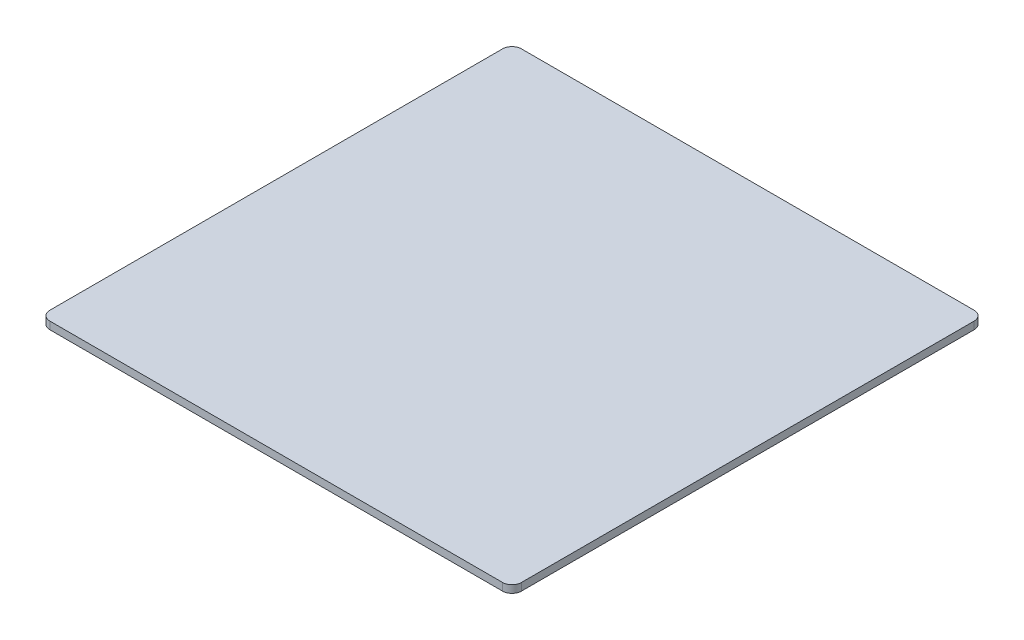
ISO-10303-21;
HEADER;
FILE_DESCRIPTION(('STEP AP214'),'2;1');
FILE_NAME('part.step','',(''),(''),'','','');
FILE_SCHEMA(('AUTOMOTIVE_DESIGN { 1 0 10303 214 1 1 1 1 }'));
ENDSEC;
DATA;
#1=APPLICATION_CONTEXT('core data for automotive mechanical design processes');
#2=APPLICATION_PROTOCOL_DEFINITION('international standard','automotive_design',2000,#1);
#3=PRODUCT_CONTEXT('',#1,'mechanical');
#4=PRODUCT('Part','Part','',(#3));
#5=PRODUCT_RELATED_PRODUCT_CATEGORY('part','',(#4));
#6=PRODUCT_DEFINITION_FORMATION('','',#4);
#7=PRODUCT_DEFINITION_CONTEXT('part definition',#1,'design');
#8=PRODUCT_DEFINITION('design','',#6,#7);
#9=PRODUCT_DEFINITION_SHAPE('','',#8);
#10=(LENGTH_UNIT() NAMED_UNIT(*) SI_UNIT(.MILLI.,.METRE.));
#11=(NAMED_UNIT(*) PLANE_ANGLE_UNIT() SI_UNIT($,.RADIAN.));
#12=(NAMED_UNIT(*) SI_UNIT($,.STERADIAN.) SOLID_ANGLE_UNIT());
#13=UNCERTAINTY_MEASURE_WITH_UNIT(LENGTH_MEASURE(1.E-05),#10,'distance_accuracy_value','');
#14=(GEOMETRIC_REPRESENTATION_CONTEXT(3) GLOBAL_UNCERTAINTY_ASSIGNED_CONTEXT((#13)) GLOBAL_UNIT_ASSIGNED_CONTEXT((#10,
#11,#12)) REPRESENTATION_CONTEXT('',''));
#15=CARTESIAN_POINT('',(0.,0.,0.));
#16=DIRECTION('',(0.,0.,1.));
#17=DIRECTION('',(1.,0.,0.));
#18=AXIS2_PLACEMENT_3D('',#15,#16,#17);
#19=CARTESIAN_POINT('',(50.,1.6,50.));
#20=DIRECTION('',(-1.,0.,0.));
#21=DIRECTION('',(0.,0.,1.));
#22=AXIS2_PLACEMENT_3D('',#19,#20,#21);
#23=PLANE('',#22);
#24=DIRECTION('',(0.,0.,-1.));
#25=VECTOR('',#24,1.);
#26=CARTESIAN_POINT('',(50.,0.,50.));
#27=LINE('',#26,#25);
#28=CARTESIAN_POINT('',(50.,0.,48.));
#29=VERTEX_POINT('',#28);
#30=CARTESIAN_POINT('',(50.,0.,-48.));
#31=VERTEX_POINT('',#30);
#32=EDGE_CURVE('E138',#29,#31,#27,.T.);
#33=ORIENTED_EDGE('',*,*,#32,.T.);
#34=DIRECTION('',(0.,-1.,0.));
#35=VECTOR('',#34,1.);
#36=CARTESIAN_POINT('',(50.,1.6,-48.));
#37=LINE('',#36,#35);
#38=CARTESIAN_POINT('',(50.,1.6,-48.));
#39=VERTEX_POINT('',#38);
#40=EDGE_CURVE('E113',#31,#39,#37,.F.);
#41=ORIENTED_EDGE('',*,*,#40,.T.);
#42=DIRECTION('',(0.,0.,-1.));
#43=VECTOR('',#42,1.);
#44=CARTESIAN_POINT('',(50.,1.6,50.));
#45=LINE('',#44,#43);
#46=CARTESIAN_POINT('',(50.,1.6,48.));
#47=VERTEX_POINT('',#46);
#48=EDGE_CURVE('E150',#47,#39,#45,.T.);
#49=ORIENTED_EDGE('',*,*,#48,.F.);
#50=DIRECTION('',(0.,-1.,0.));
#51=VECTOR('',#50,1.);
#52=CARTESIAN_POINT('',(50.,1.6,48.));
#53=LINE('',#52,#51);
#54=EDGE_CURVE('E119',#47,#29,#53,.T.);
#55=ORIENTED_EDGE('',*,*,#54,.T.);
#56=EDGE_LOOP('',(#33,#41,#49,#55));
#57=FACE_BOUND('',#56,.T.);
#58=ADVANCED_FACE('F41',(#57),#23,.F.);
#59=CARTESIAN_POINT('',(-50.,1.6,-50.));
#60=DIRECTION('',(0.,0.,1.));
#61=DIRECTION('',(1.,0.,0.));
#62=AXIS2_PLACEMENT_3D('',#59,#60,#61);
#63=PLANE('',#62);
#64=DIRECTION('',(-1.,0.,0.));
#65=VECTOR('',#64,1.);
#66=CARTESIAN_POINT('',(-50.,1.6,-50.));
#67=LINE('',#66,#65);
#68=CARTESIAN_POINT('',(48.,1.6,-50.));
#69=VERTEX_POINT('',#68);
#70=CARTESIAN_POINT('',(-48.,1.6,-50.));
#71=VERTEX_POINT('',#70);
#72=EDGE_CURVE('E129',#69,#71,#67,.T.);
#73=ORIENTED_EDGE('',*,*,#72,.F.);
#74=DIRECTION('',(0.,-1.,0.));
#75=VECTOR('',#74,1.);
#76=CARTESIAN_POINT('',(48.,1.6,-50.));
#77=LINE('',#76,#75);
#78=CARTESIAN_POINT('',(48.,0.,-50.));
#79=VERTEX_POINT('',#78);
#80=EDGE_CURVE('E112',#69,#79,#77,.T.);
#81=ORIENTED_EDGE('',*,*,#80,.T.);
#82=DIRECTION('',(-1.,0.,0.));
#83=VECTOR('',#82,1.);
#84=CARTESIAN_POINT('',(-50.,0.,-50.));
#85=LINE('',#84,#83);
#86=CARTESIAN_POINT('',(-48.,0.,-50.));
#87=VERTEX_POINT('',#86);
#88=EDGE_CURVE('E126',#79,#87,#85,.T.);
#89=ORIENTED_EDGE('',*,*,#88,.T.);
#90=DIRECTION('',(0.,-1.,0.));
#91=VECTOR('',#90,1.);
#92=CARTESIAN_POINT('',(-48.,1.6,-50.));
#93=LINE('',#92,#91);
#94=EDGE_CURVE('E132',#87,#71,#93,.F.);
#95=ORIENTED_EDGE('',*,*,#94,.T.);
#96=EDGE_LOOP('',(#73,#81,#89,#95));
#97=FACE_BOUND('',#96,.T.);
#98=ADVANCED_FACE('F125',(#97),#63,.F.);
#99=CARTESIAN_POINT('',(-50.,1.6,50.));
#100=DIRECTION('',(1.,0.,0.));
#101=DIRECTION('',(0.,0.,-1.));
#102=AXIS2_PLACEMENT_3D('',#99,#100,#101);
#103=PLANE('',#102);
#104=DIRECTION('',(0.,0.,1.));
#105=VECTOR('',#104,1.);
#106=CARTESIAN_POINT('',(-50.,1.6,50.));
#107=LINE('',#106,#105);
#108=CARTESIAN_POINT('',(-50.,1.6,-48.));
#109=VERTEX_POINT('',#108);
#110=CARTESIAN_POINT('',(-50.,1.6,48.));
#111=VERTEX_POINT('',#110);
#112=EDGE_CURVE('E186',#109,#111,#107,.T.);
#113=ORIENTED_EDGE('',*,*,#112,.F.);
#114=DIRECTION('',(0.,-1.,0.));
#115=VECTOR('',#114,1.);
#116=CARTESIAN_POINT('',(-50.,1.6,-48.));
#117=LINE('',#116,#115);
#118=CARTESIAN_POINT('',(-50.,0.,-48.));
#119=VERTEX_POINT('',#118);
#120=EDGE_CURVE('E180',#109,#119,#117,.T.);
#121=ORIENTED_EDGE('',*,*,#120,.T.);
#122=DIRECTION('',(0.,0.,1.));
#123=VECTOR('',#122,1.);
#124=CARTESIAN_POINT('',(-50.,0.,50.));
#125=LINE('',#124,#123);
#126=CARTESIAN_POINT('',(-50.,0.,48.));
#127=VERTEX_POINT('',#126);
#128=EDGE_CURVE('E137',#119,#127,#125,.T.);
#129=ORIENTED_EDGE('',*,*,#128,.T.);
#130=DIRECTION('',(0.,-1.,0.));
#131=VECTOR('',#130,1.);
#132=CARTESIAN_POINT('',(-50.,1.6,48.));
#133=LINE('',#132,#131);
#134=EDGE_CURVE('E177',#127,#111,#133,.F.);
#135=ORIENTED_EDGE('',*,*,#134,.T.);
#136=EDGE_LOOP('',(#113,#121,#129,#135));
#137=FACE_BOUND('',#136,.T.);
#138=ADVANCED_FACE('F207',(#137),#103,.F.);
#139=CARTESIAN_POINT('',(-50.,1.6,50.));
#140=DIRECTION('',(0.,0.,-1.));
#141=DIRECTION('',(-1.,0.,0.));
#142=AXIS2_PLACEMENT_3D('',#139,#140,#141);
#143=PLANE('',#142);
#144=DIRECTION('',(1.,0.,0.));
#145=VECTOR('',#144,1.);
#146=CARTESIAN_POINT('',(-50.,1.6,50.));
#147=LINE('',#146,#145);
#148=CARTESIAN_POINT('',(-48.,1.6,50.));
#149=VERTEX_POINT('',#148);
#150=CARTESIAN_POINT('',(48.,1.6,50.));
#151=VERTEX_POINT('',#150);
#152=EDGE_CURVE('E152',#149,#151,#147,.T.);
#153=ORIENTED_EDGE('',*,*,#152,.F.);
#154=DIRECTION('',(0.,-1.,0.));
#155=VECTOR('',#154,1.);
#156=CARTESIAN_POINT('',(-48.,1.6,50.));
#157=LINE('',#156,#155);
#158=CARTESIAN_POINT('',(-48.,0.,50.));
#159=VERTEX_POINT('',#158);
#160=EDGE_CURVE('E11',#149,#159,#157,.T.);
#161=ORIENTED_EDGE('',*,*,#160,.T.);
#162=DIRECTION('',(1.,0.,0.));
#163=VECTOR('',#162,1.);
#164=CARTESIAN_POINT('',(-50.,0.,50.));
#165=LINE('',#164,#163);
#166=CARTESIAN_POINT('',(48.,0.,50.));
#167=VERTEX_POINT('',#166);
#168=EDGE_CURVE('E143',#159,#167,#165,.T.);
#169=ORIENTED_EDGE('',*,*,#168,.T.);
#170=DIRECTION('',(0.,-1.,0.));
#171=VECTOR('',#170,1.);
#172=CARTESIAN_POINT('',(48.,1.6,50.));
#173=LINE('',#172,#171);
#174=EDGE_CURVE('E50',#167,#151,#173,.F.);
#175=ORIENTED_EDGE('',*,*,#174,.T.);
#176=EDGE_LOOP('',(#153,#161,#169,#175));
#177=FACE_BOUND('',#176,.T.);
#178=ADVANCED_FACE('F200',(#177),#143,.F.);
#179=CARTESIAN_POINT('',(0.,1.6,0.));
#180=DIRECTION('',(0.,-1.,0.));
#181=DIRECTION('',(0.,0.,-1.));
#182=AXIS2_PLACEMENT_3D('',#179,#180,#181);
#183=PLANE('',#182);
#184=ORIENTED_EDGE('',*,*,#48,.T.);
#185=CARTESIAN_POINT('',(48.,1.6,-48.));
#186=DIRECTION('',(0.,-1.,0.));
#187=DIRECTION('',(0.,0.,-1.));
#188=AXIS2_PLACEMENT_3D('',#185,#186,#187);
#189=CIRCLE('',#188,2.);
#190=EDGE_CURVE('E174',#39,#69,#189,.F.);
#191=ORIENTED_EDGE('',*,*,#190,.T.);
#192=ORIENTED_EDGE('',*,*,#72,.T.);
#193=CARTESIAN_POINT('',(-48.,1.6,-48.));
#194=DIRECTION('',(0.,-1.,0.));
#195=DIRECTION('',(0.,0.,-1.));
#196=AXIS2_PLACEMENT_3D('',#193,#194,#195);
#197=CIRCLE('',#196,2.);
#198=EDGE_CURVE('E171',#71,#109,#197,.F.);
#199=ORIENTED_EDGE('',*,*,#198,.T.);
#200=ORIENTED_EDGE('',*,*,#112,.T.);
#201=CARTESIAN_POINT('',(-48.,1.6,48.));
#202=DIRECTION('',(0.,-1.,0.));
#203=DIRECTION('',(0.,0.,-1.));
#204=AXIS2_PLACEMENT_3D('',#201,#202,#203);
#205=CIRCLE('',#204,2.);
#206=EDGE_CURVE('E63',#111,#149,#205,.F.);
#207=ORIENTED_EDGE('',*,*,#206,.T.);
#208=ORIENTED_EDGE('',*,*,#152,.T.);
#209=CARTESIAN_POINT('',(48.,1.6,48.));
#210=DIRECTION('',(0.,-1.,0.));
#211=DIRECTION('',(0.,0.,-1.));
#212=AXIS2_PLACEMENT_3D('',#209,#210,#211);
#213=CIRCLE('',#212,2.);
#214=EDGE_CURVE('E166',#151,#47,#213,.F.);
#215=ORIENTED_EDGE('',*,*,#214,.T.);
#216=EDGE_LOOP('',(#184,#191,#192,#199,#200,#207,#208,#215));
#217=FACE_BOUND('',#216,.T.);
#218=ADVANCED_FACE('F194',(#217),#183,.F.);
#219=CARTESIAN_POINT('',(0.,0.,0.));
#220=DIRECTION('',(0.,-1.,0.));
#221=DIRECTION('',(0.,0.,-1.));
#222=AXIS2_PLACEMENT_3D('',#219,#220,#221);
#223=PLANE('',#222);
#224=ORIENTED_EDGE('',*,*,#88,.F.);
#225=CARTESIAN_POINT('',(48.,0.,-48.));
#226=DIRECTION('',(0.,-1.,0.));
#227=DIRECTION('',(0.,0.,-1.));
#228=AXIS2_PLACEMENT_3D('',#225,#226,#227);
#229=CIRCLE('',#228,2.);
#230=EDGE_CURVE('E108',#79,#31,#229,.T.);
#231=ORIENTED_EDGE('',*,*,#230,.T.);
#232=ORIENTED_EDGE('',*,*,#32,.F.);
#233=CARTESIAN_POINT('',(48.,0.,48.));
#234=DIRECTION('',(0.,-1.,0.));
#235=DIRECTION('',(0.,0.,-1.));
#236=AXIS2_PLACEMENT_3D('',#233,#234,#235);
#237=CIRCLE('',#236,2.);
#238=EDGE_CURVE('E131',#29,#167,#237,.T.);
#239=ORIENTED_EDGE('',*,*,#238,.T.);
#240=ORIENTED_EDGE('',*,*,#168,.F.);
#241=CARTESIAN_POINT('',(-48.,0.,48.));
#242=DIRECTION('',(0.,-1.,0.));
#243=DIRECTION('',(0.,0.,-1.));
#244=AXIS2_PLACEMENT_3D('',#241,#242,#243);
#245=CIRCLE('',#244,2.);
#246=EDGE_CURVE('E156',#159,#127,#245,.T.);
#247=ORIENTED_EDGE('',*,*,#246,.T.);
#248=ORIENTED_EDGE('',*,*,#128,.F.);
#249=CARTESIAN_POINT('',(-48.,0.,-48.));
#250=DIRECTION('',(0.,-1.,0.));
#251=DIRECTION('',(0.,0.,-1.));
#252=AXIS2_PLACEMENT_3D('',#249,#250,#251);
#253=CIRCLE('',#252,2.);
#254=EDGE_CURVE('E120',#119,#87,#253,.T.);
#255=ORIENTED_EDGE('',*,*,#254,.T.);
#256=EDGE_LOOP('',(#224,#231,#232,#239,#240,#247,#248,#255));
#257=FACE_BOUND('',#256,.T.);
#258=ADVANCED_FACE('F134',(#257),#223,.T.);
#259=CARTESIAN_POINT('',(48.,1.6,-48.));
#260=DIRECTION('',(0.,-1.,0.));
#261=DIRECTION('',(0.,0.,-1.));
#262=AXIS2_PLACEMENT_3D('',#259,#260,#261);
#263=CYLINDRICAL_SURFACE('',#262,2.);
#264=ORIENTED_EDGE('',*,*,#190,.F.);
#265=ORIENTED_EDGE('',*,*,#40,.F.);
#266=ORIENTED_EDGE('',*,*,#230,.F.);
#267=ORIENTED_EDGE('',*,*,#80,.F.);
#268=EDGE_LOOP('',(#264,#265,#266,#267));
#269=FACE_BOUND('',#268,.T.);
#270=ADVANCED_FACE('F111',(#269),#263,.T.);
#271=CARTESIAN_POINT('',(-48.,1.6,-48.));
#272=DIRECTION('',(0.,-1.,0.));
#273=DIRECTION('',(0.,0.,-1.));
#274=AXIS2_PLACEMENT_3D('',#271,#272,#273);
#275=CYLINDRICAL_SURFACE('',#274,2.);
#276=ORIENTED_EDGE('',*,*,#198,.F.);
#277=ORIENTED_EDGE('',*,*,#94,.F.);
#278=ORIENTED_EDGE('',*,*,#254,.F.);
#279=ORIENTED_EDGE('',*,*,#120,.F.);
#280=EDGE_LOOP('',(#276,#277,#278,#279));
#281=FACE_BOUND('',#280,.T.);
#282=ADVANCED_FACE('F211',(#281),#275,.T.);
#283=CARTESIAN_POINT('',(-48.,1.6,48.));
#284=DIRECTION('',(0.,-1.,0.));
#285=DIRECTION('',(0.,0.,-1.));
#286=AXIS2_PLACEMENT_3D('',#283,#284,#285);
#287=CYLINDRICAL_SURFACE('',#286,2.);
#288=ORIENTED_EDGE('',*,*,#206,.F.);
#289=ORIENTED_EDGE('',*,*,#134,.F.);
#290=ORIENTED_EDGE('',*,*,#246,.F.);
#291=ORIENTED_EDGE('',*,*,#160,.F.);
#292=EDGE_LOOP('',(#288,#289,#290,#291));
#293=FACE_BOUND('',#292,.T.);
#294=ADVANCED_FACE('F203',(#293),#287,.T.);
#295=CARTESIAN_POINT('',(48.,1.6,48.));
#296=DIRECTION('',(0.,-1.,0.));
#297=DIRECTION('',(0.,0.,-1.));
#298=AXIS2_PLACEMENT_3D('',#295,#296,#297);
#299=CYLINDRICAL_SURFACE('',#298,2.);
#300=ORIENTED_EDGE('',*,*,#214,.F.);
#301=ORIENTED_EDGE('',*,*,#174,.F.);
#302=ORIENTED_EDGE('',*,*,#238,.F.);
#303=ORIENTED_EDGE('',*,*,#54,.F.);
#304=EDGE_LOOP('',(#300,#301,#302,#303));
#305=FACE_BOUND('',#304,.T.);
#306=ADVANCED_FACE('F43',(#305),#299,.T.);
#307=CLOSED_SHELL('',(#58,#98,#138,#178,#218,#258,#270,#282,#294,#306));
#308=MANIFOLD_SOLID_BREP('B2',#307);
#309=ADVANCED_BREP_SHAPE_REPRESENTATION('',(#18,#308),#14);
#310=SHAPE_DEFINITION_REPRESENTATION(#9,#309);
ENDSEC;
END-ISO-10303-21;
